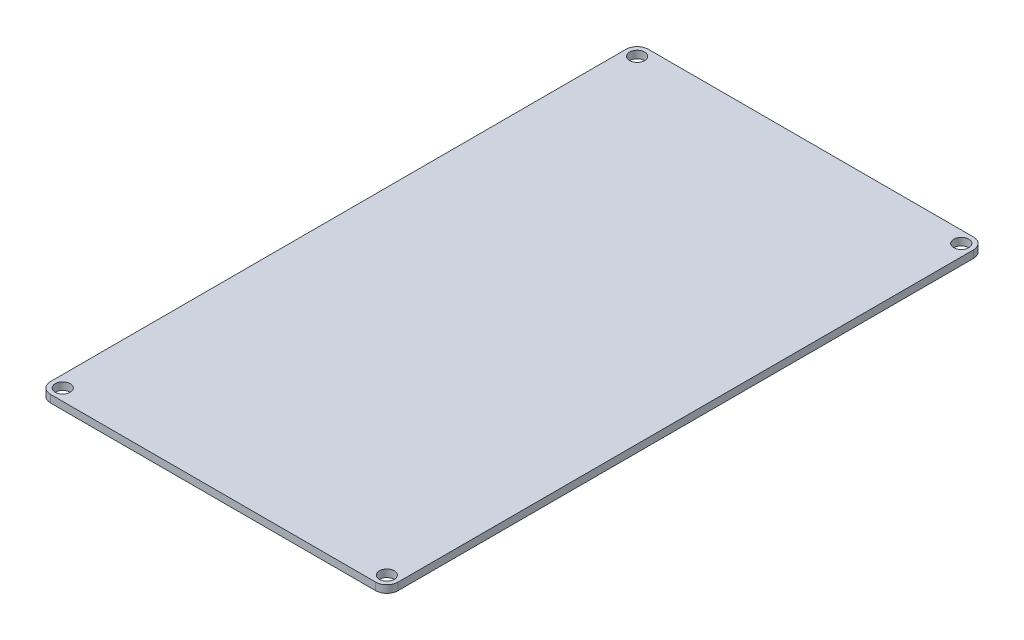
ISO-10303-21;
HEADER;
FILE_DESCRIPTION(('STEP AP214'),'2;1');
FILE_NAME('part.step','',(''),(''),'','','');
FILE_SCHEMA(('AUTOMOTIVE_DESIGN { 1 0 10303 214 1 1 1 1 }'));
ENDSEC;
DATA;
#1=APPLICATION_CONTEXT('core data for automotive mechanical design processes');
#2=APPLICATION_PROTOCOL_DEFINITION('international standard','automotive_design',2000,#1);
#3=PRODUCT_CONTEXT('',#1,'mechanical');
#4=PRODUCT('Part','Part','',(#3));
#5=PRODUCT_RELATED_PRODUCT_CATEGORY('part','',(#4));
#6=PRODUCT_DEFINITION_FORMATION('','',#4);
#7=PRODUCT_DEFINITION_CONTEXT('part definition',#1,'design');
#8=PRODUCT_DEFINITION('design','',#6,#7);
#9=PRODUCT_DEFINITION_SHAPE('','',#8);
#10=(LENGTH_UNIT() NAMED_UNIT(*) SI_UNIT(.MILLI.,.METRE.));
#11=(NAMED_UNIT(*) PLANE_ANGLE_UNIT() SI_UNIT($,.RADIAN.));
#12=(NAMED_UNIT(*) SI_UNIT($,.STERADIAN.) SOLID_ANGLE_UNIT());
#13=UNCERTAINTY_MEASURE_WITH_UNIT(LENGTH_MEASURE(1.E-05),#10,'distance_accuracy_value','');
#14=(GEOMETRIC_REPRESENTATION_CONTEXT(3) GLOBAL_UNCERTAINTY_ASSIGNED_CONTEXT((#13)) GLOBAL_UNIT_ASSIGNED_CONTEXT((#10,
#11,#12)) REPRESENTATION_CONTEXT('',''));
#15=CARTESIAN_POINT('',(0.,0.,0.));
#16=DIRECTION('',(0.,0.,1.));
#17=DIRECTION('',(1.,0.,0.));
#18=AXIS2_PLACEMENT_3D('',#15,#16,#17);
#19=CARTESIAN_POINT('',(0.,2.,-160.));
#20=DIRECTION('',(0.,0.,-1.));
#21=DIRECTION('',(-1.,0.,0.));
#22=AXIS2_PLACEMENT_3D('',#19,#20,#21);
#23=PLANE('',#22);
#24=DIRECTION('',(1.,0.,0.));
#25=VECTOR('',#24,1.);
#26=CARTESIAN_POINT('',(0.,2.,-160.));
#27=LINE('',#26,#25);
#28=CARTESIAN_POINT('',(3.,2.,-160.));
#29=VERTEX_POINT('',#28);
#30=CARTESIAN_POINT('',(90.,2.,-160.));
#31=VERTEX_POINT('',#30);
#32=EDGE_CURVE('E192',#29,#31,#27,.T.);
#33=ORIENTED_EDGE('',*,*,#32,.T.);
#34=DIRECTION('',(0.,-1.,0.));
#35=VECTOR('',#34,1.);
#36=CARTESIAN_POINT('',(90.,0.,-160.));
#37=LINE('',#36,#35);
#38=CARTESIAN_POINT('',(90.,0.,-160.));
#39=VERTEX_POINT('',#38);
#40=EDGE_CURVE('E11',#31,#39,#37,.T.);
#41=ORIENTED_EDGE('',*,*,#40,.T.);
#42=DIRECTION('',(1.,0.,0.));
#43=VECTOR('',#42,1.);
#44=CARTESIAN_POINT('',(0.,0.,-160.));
#45=LINE('',#44,#43);
#46=CARTESIAN_POINT('',(3.,0.,-160.));
#47=VERTEX_POINT('',#46);
#48=EDGE_CURVE('E147',#47,#39,#45,.T.);
#49=ORIENTED_EDGE('',*,*,#48,.F.);
#50=DIRECTION('',(0.,-1.,0.));
#51=VECTOR('',#50,1.);
#52=CARTESIAN_POINT('',(3.,2.,-160.));
#53=LINE('',#52,#51);
#54=EDGE_CURVE('E52',#47,#29,#53,.F.);
#55=ORIENTED_EDGE('',*,*,#54,.T.);
#56=EDGE_LOOP('',(#33,#41,#49,#55));
#57=FACE_BOUND('',#56,.T.);
#58=ADVANCED_FACE('F43',(#57),#23,.T.);
#59=CARTESIAN_POINT('',(0.,2.,0.));
#60=DIRECTION('',(-1.,0.,0.));
#61=DIRECTION('',(0.,0.,1.));
#62=AXIS2_PLACEMENT_3D('',#59,#60,#61);
#63=PLANE('',#62);
#64=DIRECTION('',(0.,0.,-1.));
#65=VECTOR('',#64,1.);
#66=CARTESIAN_POINT('',(0.,0.,0.));
#67=LINE('',#66,#65);
#68=CARTESIAN_POINT('',(0.,0.,-3.));
#69=VERTEX_POINT('',#68);
#70=CARTESIAN_POINT('',(0.,0.,-157.));
#71=VERTEX_POINT('',#70);
#72=EDGE_CURVE('E141',#69,#71,#67,.T.);
#73=ORIENTED_EDGE('',*,*,#72,.F.);
#74=DIRECTION('',(0.,-1.,0.));
#75=VECTOR('',#74,1.);
#76=CARTESIAN_POINT('',(0.,2.,-3.));
#77=LINE('',#76,#75);
#78=CARTESIAN_POINT('',(0.,2.,-3.));
#79=VERTEX_POINT('',#78);
#80=EDGE_CURVE('E116',#69,#79,#77,.F.);
#81=ORIENTED_EDGE('',*,*,#80,.T.);
#82=DIRECTION('',(0.,0.,-1.));
#83=VECTOR('',#82,1.);
#84=CARTESIAN_POINT('',(0.,2.,0.));
#85=LINE('',#84,#83);
#86=CARTESIAN_POINT('',(0.,2.,-157.));
#87=VERTEX_POINT('',#86);
#88=EDGE_CURVE('E203',#79,#87,#85,.T.);
#89=ORIENTED_EDGE('',*,*,#88,.T.);
#90=DIRECTION('',(0.,-1.,0.));
#91=VECTOR('',#90,1.);
#92=CARTESIAN_POINT('',(0.,2.,-157.));
#93=LINE('',#92,#91);
#94=EDGE_CURVE('E122',#87,#71,#93,.T.);
#95=ORIENTED_EDGE('',*,*,#94,.T.);
#96=EDGE_LOOP('',(#73,#81,#89,#95));
#97=FACE_BOUND('',#96,.T.);
#98=ADVANCED_FACE('F208',(#97),#63,.T.);
#99=CARTESIAN_POINT('',(0.,2.,0.));
#100=DIRECTION('',(0.,0.,-1.));
#101=DIRECTION('',(-1.,0.,0.));
#102=AXIS2_PLACEMENT_3D('',#99,#100,#101);
#103=PLANE('',#102);
#104=DIRECTION('',(1.,0.,0.));
#105=VECTOR('',#104,1.);
#106=CARTESIAN_POINT('',(0.,2.,0.));
#107=LINE('',#106,#105);
#108=CARTESIAN_POINT('',(3.,2.,0.));
#109=VERTEX_POINT('',#108);
#110=CARTESIAN_POINT('',(90.,2.,0.));
#111=VERTEX_POINT('',#110);
#112=EDGE_CURVE('E131',#109,#111,#107,.T.);
#113=ORIENTED_EDGE('',*,*,#112,.F.);
#114=DIRECTION('',(0.,-1.,0.));
#115=VECTOR('',#114,1.);
#116=CARTESIAN_POINT('',(3.,0.,0.));
#117=LINE('',#116,#115);
#118=CARTESIAN_POINT('',(3.,0.,0.));
#119=VERTEX_POINT('',#118);
#120=EDGE_CURVE('E115',#109,#119,#117,.T.);
#121=ORIENTED_EDGE('',*,*,#120,.T.);
#122=DIRECTION('',(1.,0.,0.));
#123=VECTOR('',#122,1.);
#124=CARTESIAN_POINT('',(0.,0.,0.));
#125=LINE('',#124,#123);
#126=CARTESIAN_POINT('',(90.,0.,0.));
#127=VERTEX_POINT('',#126);
#128=EDGE_CURVE('E129',#119,#127,#125,.T.);
#129=ORIENTED_EDGE('',*,*,#128,.T.);
#130=DIRECTION('',(0.,-1.,0.));
#131=VECTOR('',#130,1.);
#132=CARTESIAN_POINT('',(90.,2.,0.));
#133=LINE('',#132,#131);
#134=EDGE_CURVE('E134',#127,#111,#133,.F.);
#135=ORIENTED_EDGE('',*,*,#134,.T.);
#136=EDGE_LOOP('',(#113,#121,#129,#135));
#137=FACE_BOUND('',#136,.T.);
#138=ADVANCED_FACE('F128',(#137),#103,.F.);
#139=CARTESIAN_POINT('',(93.,2.,0.));
#140=DIRECTION('',(-1.,0.,0.));
#141=DIRECTION('',(0.,0.,1.));
#142=AXIS2_PLACEMENT_3D('',#139,#140,#141);
#143=PLANE('',#142);
#144=DIRECTION('',(0.,0.,-1.));
#145=VECTOR('',#144,1.);
#146=CARTESIAN_POINT('',(93.,2.,0.));
#147=LINE('',#146,#145);
#148=CARTESIAN_POINT('',(93.,2.,-3.));
#149=VERTEX_POINT('',#148);
#150=CARTESIAN_POINT('',(93.,2.,-157.));
#151=VERTEX_POINT('',#150);
#152=EDGE_CURVE('E226',#149,#151,#147,.T.);
#153=ORIENTED_EDGE('',*,*,#152,.F.);
#154=DIRECTION('',(0.,-1.,0.));
#155=VECTOR('',#154,1.);
#156=CARTESIAN_POINT('',(93.,2.,-3.));
#157=LINE('',#156,#155);
#158=CARTESIAN_POINT('',(93.,0.,-3.));
#159=VERTEX_POINT('',#158);
#160=EDGE_CURVE('E183',#149,#159,#157,.T.);
#161=ORIENTED_EDGE('',*,*,#160,.T.);
#162=DIRECTION('',(0.,0.,-1.));
#163=VECTOR('',#162,1.);
#164=CARTESIAN_POINT('',(93.,0.,0.));
#165=LINE('',#164,#163);
#166=CARTESIAN_POINT('',(93.,0.,-157.));
#167=VERTEX_POINT('',#166);
#168=EDGE_CURVE('E140',#159,#167,#165,.T.);
#169=ORIENTED_EDGE('',*,*,#168,.T.);
#170=DIRECTION('',(0.,-1.,0.));
#171=VECTOR('',#170,1.);
#172=CARTESIAN_POINT('',(93.,2.,-157.));
#173=LINE('',#172,#171);
#174=EDGE_CURVE('E59',#167,#151,#173,.F.);
#175=ORIENTED_EDGE('',*,*,#174,.T.);
#176=EDGE_LOOP('',(#153,#161,#169,#175));
#177=FACE_BOUND('',#176,.T.);
#178=ADVANCED_FACE('F259',(#177),#143,.F.);
#179=CARTESIAN_POINT('',(3.1210255500278,2.,-3.1210255500278));
#180=DIRECTION('',(0.,-1.,0.));
#181=DIRECTION('',(0.,0.,-1.));
#182=AXIS2_PLACEMENT_3D('',#179,#180,#181);
#183=CYLINDRICAL_SURFACE('',#182,2.);
#184=CARTESIAN_POINT('',(3.1210255500278,2.,-3.1210255500278));
#185=DIRECTION('',(0.,1.,0.));
#186=DIRECTION('',(0.,0.,1.));
#187=AXIS2_PLACEMENT_3D('',#184,#185,#186);
#188=CIRCLE('',#187,2.);
#189=CARTESIAN_POINT('',(3.1210255500278,2.,-1.1210255500278));
#190=VERTEX_POINT('',#189);
#191=EDGE_CURVE('E204',#190,#190,#188,.T.);
#192=ORIENTED_EDGE('',*,*,#191,.T.);
#193=EDGE_LOOP('',(#192));
#194=FACE_BOUND('',#193,.T.);
#195=CARTESIAN_POINT('',(3.1210255500278,0.,-3.1210255500278));
#196=DIRECTION('',(0.,1.,0.));
#197=DIRECTION('',(0.,0.,1.));
#198=AXIS2_PLACEMENT_3D('',#195,#196,#197);
#199=CIRCLE('',#198,2.);
#200=CARTESIAN_POINT('',(3.1210255500278,0.,-1.1210255500278));
#201=VERTEX_POINT('',#200);
#202=EDGE_CURVE('E210',#201,#201,#199,.T.);
#203=ORIENTED_EDGE('',*,*,#202,.F.);
#204=EDGE_LOOP('',(#203));
#205=FACE_BOUND('',#204,.T.);
#206=ADVANCED_FACE('F255',(#194,#205),#183,.F.);
#207=CARTESIAN_POINT('',(89.8789744499722,2.,-3.1210255500278));
#208=DIRECTION('',(0.,-1.,0.));
#209=DIRECTION('',(0.,0.,-1.));
#210=AXIS2_PLACEMENT_3D('',#207,#208,#209);
#211=CYLINDRICAL_SURFACE('',#210,2.);
#212=CARTESIAN_POINT('',(89.8789744499722,2.,-3.1210255500278));
#213=DIRECTION('',(0.,1.,0.));
#214=DIRECTION('',(0.,0.,1.));
#215=AXIS2_PLACEMENT_3D('',#212,#213,#214);
#216=CIRCLE('',#215,2.);
#217=CARTESIAN_POINT('',(89.8789744499722,2.,-1.1210255500278));
#218=VERTEX_POINT('',#217);
#219=EDGE_CURVE('E236',#218,#218,#216,.F.);
#220=ORIENTED_EDGE('',*,*,#219,.F.);
#221=EDGE_LOOP('',(#220));
#222=FACE_BOUND('',#221,.T.);
#223=CARTESIAN_POINT('',(89.8789744499722,0.,-3.1210255500278));
#224=DIRECTION('',(0.,1.,0.));
#225=DIRECTION('',(0.,0.,1.));
#226=AXIS2_PLACEMENT_3D('',#223,#224,#225);
#227=CIRCLE('',#226,2.);
#228=CARTESIAN_POINT('',(89.8789744499722,0.,-1.1210255500278));
#229=VERTEX_POINT('',#228);
#230=EDGE_CURVE('E213',#229,#229,#227,.F.);
#231=ORIENTED_EDGE('',*,*,#230,.T.);
#232=EDGE_LOOP('',(#231));
#233=FACE_BOUND('',#232,.T.);
#234=ADVANCED_FACE('F258',(#222,#233),#211,.F.);
#235=CARTESIAN_POINT('',(89.8789744499721,2.,-156.878974449972));
#236=DIRECTION('',(0.,-1.,0.));
#237=DIRECTION('',(0.,0.,-1.));
#238=AXIS2_PLACEMENT_3D('',#235,#236,#237);
#239=CYLINDRICAL_SURFACE('',#238,2.);
#240=CARTESIAN_POINT('',(89.8789744499721,2.,-156.878974449972));
#241=DIRECTION('',(0.,1.,0.));
#242=DIRECTION('',(0.,0.,1.));
#243=AXIS2_PLACEMENT_3D('',#240,#241,#242);
#244=CIRCLE('',#243,2.);
#245=CARTESIAN_POINT('',(89.8789744499721,2.,-154.878974449972));
#246=VERTEX_POINT('',#245);
#247=EDGE_CURVE('E154',#246,#246,#244,.T.);
#248=ORIENTED_EDGE('',*,*,#247,.T.);
#249=EDGE_LOOP('',(#248));
#250=FACE_BOUND('',#249,.T.);
#251=CARTESIAN_POINT('',(89.8789744499721,0.,-156.878974449972));
#252=DIRECTION('',(0.,1.,0.));
#253=DIRECTION('',(0.,0.,1.));
#254=AXIS2_PLACEMENT_3D('',#251,#252,#253);
#255=CIRCLE('',#254,2.);
#256=CARTESIAN_POINT('',(89.8789744499721,0.,-154.878974449972));
#257=VERTEX_POINT('',#256);
#258=EDGE_CURVE('E219',#257,#257,#255,.T.);
#259=ORIENTED_EDGE('',*,*,#258,.F.);
#260=EDGE_LOOP('',(#259));
#261=FACE_BOUND('',#260,.T.);
#262=ADVANCED_FACE('F244',(#250,#261),#239,.F.);
#263=CARTESIAN_POINT('',(3.12102555002776,2.,-156.878974449972));
#264=DIRECTION('',(0.,-1.,0.));
#265=DIRECTION('',(0.,0.,-1.));
#266=AXIS2_PLACEMENT_3D('',#263,#264,#265);
#267=CYLINDRICAL_SURFACE('',#266,2.);
#268=CARTESIAN_POINT('',(3.12102555002776,2.,-156.878974449972));
#269=DIRECTION('',(0.,1.,0.));
#270=DIRECTION('',(0.,0.,1.));
#271=AXIS2_PLACEMENT_3D('',#268,#269,#270);
#272=CIRCLE('',#271,2.);
#273=CARTESIAN_POINT('',(3.12102555002776,2.,-154.878974449972));
#274=VERTEX_POINT('',#273);
#275=EDGE_CURVE('E156',#274,#274,#272,.F.);
#276=ORIENTED_EDGE('',*,*,#275,.F.);
#277=EDGE_LOOP('',(#276));
#278=FACE_BOUND('',#277,.T.);
#279=CARTESIAN_POINT('',(3.12102555002776,0.,-156.878974449972));
#280=DIRECTION('',(0.,1.,0.));
#281=DIRECTION('',(0.,0.,1.));
#282=AXIS2_PLACEMENT_3D('',#279,#280,#281);
#283=CIRCLE('',#282,2.);
#284=CARTESIAN_POINT('',(3.12102555002776,0.,-154.878974449972));
#285=VERTEX_POINT('',#284);
#286=EDGE_CURVE('E145',#285,#285,#283,.F.);
#287=ORIENTED_EDGE('',*,*,#286,.T.);
#288=EDGE_LOOP('',(#287));
#289=FACE_BOUND('',#288,.T.);
#290=ADVANCED_FACE('F249',(#278,#289),#267,.F.);
#291=CARTESIAN_POINT('',(0.,2.,0.));
#292=DIRECTION('',(0.,1.,0.));
#293=DIRECTION('',(0.,0.,1.));
#294=AXIS2_PLACEMENT_3D('',#291,#292,#293);
#295=PLANE('',#294);
#296=ORIENTED_EDGE('',*,*,#247,.F.);
#297=EDGE_LOOP('',(#296));
#298=FACE_BOUND('',#297,.T.);
#299=ORIENTED_EDGE('',*,*,#219,.T.);
#300=EDGE_LOOP('',(#299));
#301=FACE_BOUND('',#300,.T.);
#302=ORIENTED_EDGE('',*,*,#191,.F.);
#303=EDGE_LOOP('',(#302));
#304=FACE_BOUND('',#303,.T.);
#305=ORIENTED_EDGE('',*,*,#88,.F.);
#306=CARTESIAN_POINT('',(3.,2.,-3.));
#307=DIRECTION('',(0.,1.,0.));
#308=DIRECTION('',(0.,0.,1.));
#309=AXIS2_PLACEMENT_3D('',#306,#307,#308);
#310=CIRCLE('',#309,3.);
#311=EDGE_CURVE('E178',#79,#109,#310,.T.);
#312=ORIENTED_EDGE('',*,*,#311,.T.);
#313=ORIENTED_EDGE('',*,*,#112,.T.);
#314=CARTESIAN_POINT('',(90.,2.,-3.));
#315=DIRECTION('',(0.,1.,0.));
#316=DIRECTION('',(0.,0.,1.));
#317=AXIS2_PLACEMENT_3D('',#314,#315,#316);
#318=CIRCLE('',#317,3.);
#319=EDGE_CURVE('E66',#111,#149,#318,.T.);
#320=ORIENTED_EDGE('',*,*,#319,.T.);
#321=ORIENTED_EDGE('',*,*,#152,.T.);
#322=CARTESIAN_POINT('',(90.,2.,-157.));
#323=DIRECTION('',(0.,1.,0.));
#324=DIRECTION('',(0.,0.,1.));
#325=AXIS2_PLACEMENT_3D('',#322,#323,#324);
#326=CIRCLE('',#325,3.);
#327=EDGE_CURVE('E173',#151,#31,#326,.T.);
#328=ORIENTED_EDGE('',*,*,#327,.T.);
#329=ORIENTED_EDGE('',*,*,#32,.F.);
#330=CARTESIAN_POINT('',(3.,2.,-157.));
#331=DIRECTION('',(0.,1.,0.));
#332=DIRECTION('',(0.,0.,1.));
#333=AXIS2_PLACEMENT_3D('',#330,#331,#332);
#334=CIRCLE('',#333,3.);
#335=EDGE_CURVE('E170',#29,#87,#334,.T.);
#336=ORIENTED_EDGE('',*,*,#335,.T.);
#337=EDGE_LOOP('',(#305,#312,#313,#320,#321,#328,#329,#336));
#338=FACE_BOUND('',#337,.T.);
#339=ORIENTED_EDGE('',*,*,#275,.T.);
#340=EDGE_LOOP('',(#339));
#341=FACE_BOUND('',#340,.T.);
#342=ADVANCED_FACE('F198',(#298,#301,#304,#338,#341),#295,.T.);
#343=CARTESIAN_POINT('',(0.,0.,0.));
#344=DIRECTION('',(0.,1.,0.));
#345=DIRECTION('',(0.,0.,1.));
#346=AXIS2_PLACEMENT_3D('',#343,#344,#345);
#347=PLANE('',#346);
#348=ORIENTED_EDGE('',*,*,#258,.T.);
#349=EDGE_LOOP('',(#348));
#350=FACE_BOUND('',#349,.T.);
#351=ORIENTED_EDGE('',*,*,#230,.F.);
#352=EDGE_LOOP('',(#351));
#353=FACE_BOUND('',#352,.T.);
#354=ORIENTED_EDGE('',*,*,#202,.T.);
#355=EDGE_LOOP('',(#354));
#356=FACE_BOUND('',#355,.T.);
#357=ORIENTED_EDGE('',*,*,#128,.F.);
#358=CARTESIAN_POINT('',(3.,0.,-3.));
#359=DIRECTION('',(0.,1.,0.));
#360=DIRECTION('',(0.,0.,1.));
#361=AXIS2_PLACEMENT_3D('',#358,#359,#360);
#362=CIRCLE('',#361,3.);
#363=EDGE_CURVE('E111',#119,#69,#362,.F.);
#364=ORIENTED_EDGE('',*,*,#363,.T.);
#365=ORIENTED_EDGE('',*,*,#72,.T.);
#366=CARTESIAN_POINT('',(3.,0.,-157.));
#367=DIRECTION('',(0.,1.,0.));
#368=DIRECTION('',(0.,0.,1.));
#369=AXIS2_PLACEMENT_3D('',#366,#367,#368);
#370=CIRCLE('',#369,3.);
#371=EDGE_CURVE('E133',#71,#47,#370,.F.);
#372=ORIENTED_EDGE('',*,*,#371,.T.);
#373=ORIENTED_EDGE('',*,*,#48,.T.);
#374=CARTESIAN_POINT('',(90.,0.,-157.));
#375=DIRECTION('',(0.,1.,0.));
#376=DIRECTION('',(0.,0.,1.));
#377=AXIS2_PLACEMENT_3D('',#374,#375,#376);
#378=CIRCLE('',#377,3.);
#379=EDGE_CURVE('E160',#39,#167,#378,.F.);
#380=ORIENTED_EDGE('',*,*,#379,.T.);
#381=ORIENTED_EDGE('',*,*,#168,.F.);
#382=CARTESIAN_POINT('',(90.,0.,-3.));
#383=DIRECTION('',(0.,1.,0.));
#384=DIRECTION('',(0.,0.,1.));
#385=AXIS2_PLACEMENT_3D('',#382,#383,#384);
#386=CIRCLE('',#385,3.);
#387=EDGE_CURVE('E123',#159,#127,#386,.F.);
#388=ORIENTED_EDGE('',*,*,#387,.T.);
#389=EDGE_LOOP('',(#357,#364,#365,#372,#373,#380,#381,#388));
#390=FACE_BOUND('',#389,.T.);
#391=ORIENTED_EDGE('',*,*,#286,.F.);
#392=EDGE_LOOP('',(#391));
#393=FACE_BOUND('',#392,.T.);
#394=ADVANCED_FACE('F136',(#350,#353,#356,#390,#393),#347,.F.);
#395=CARTESIAN_POINT('',(3.,2.,-3.));
#396=DIRECTION('',(0.,1.,0.));
#397=DIRECTION('',(0.,0.,1.));
#398=AXIS2_PLACEMENT_3D('',#395,#396,#397);
#399=CYLINDRICAL_SURFACE('',#398,3.);
#400=ORIENTED_EDGE('',*,*,#311,.F.);
#401=ORIENTED_EDGE('',*,*,#80,.F.);
#402=ORIENTED_EDGE('',*,*,#363,.F.);
#403=ORIENTED_EDGE('',*,*,#120,.F.);
#404=EDGE_LOOP('',(#400,#401,#402,#403));
#405=FACE_BOUND('',#404,.T.);
#406=ADVANCED_FACE('F114',(#405),#399,.T.);
#407=CARTESIAN_POINT('',(90.,2.,-3.));
#408=DIRECTION('',(0.,-1.,0.));
#409=DIRECTION('',(0.,0.,-1.));
#410=AXIS2_PLACEMENT_3D('',#407,#408,#409);
#411=CYLINDRICAL_SURFACE('',#410,3.);
#412=ORIENTED_EDGE('',*,*,#319,.F.);
#413=ORIENTED_EDGE('',*,*,#134,.F.);
#414=ORIENTED_EDGE('',*,*,#387,.F.);
#415=ORIENTED_EDGE('',*,*,#160,.F.);
#416=EDGE_LOOP('',(#412,#413,#414,#415));
#417=FACE_BOUND('',#416,.T.);
#418=ADVANCED_FACE('F269',(#417),#411,.T.);
#419=CARTESIAN_POINT('',(90.,2.,-157.));
#420=DIRECTION('',(0.,1.,0.));
#421=DIRECTION('',(0.,0.,1.));
#422=AXIS2_PLACEMENT_3D('',#419,#420,#421);
#423=CYLINDRICAL_SURFACE('',#422,3.);
#424=ORIENTED_EDGE('',*,*,#327,.F.);
#425=ORIENTED_EDGE('',*,*,#174,.F.);
#426=ORIENTED_EDGE('',*,*,#379,.F.);
#427=ORIENTED_EDGE('',*,*,#40,.F.);
#428=EDGE_LOOP('',(#424,#425,#426,#427));
#429=FACE_BOUND('',#428,.T.);
#430=ADVANCED_FACE('F287',(#429),#423,.T.);
#431=CARTESIAN_POINT('',(3.,2.,-157.));
#432=DIRECTION('',(0.,-1.,0.));
#433=DIRECTION('',(0.,0.,-1.));
#434=AXIS2_PLACEMENT_3D('',#431,#432,#433);
#435=CYLINDRICAL_SURFACE('',#434,3.);
#436=ORIENTED_EDGE('',*,*,#335,.F.);
#437=ORIENTED_EDGE('',*,*,#54,.F.);
#438=ORIENTED_EDGE('',*,*,#371,.F.);
#439=ORIENTED_EDGE('',*,*,#94,.F.);
#440=EDGE_LOOP('',(#436,#437,#438,#439));
#441=FACE_BOUND('',#440,.T.);
#442=ADVANCED_FACE('F45',(#441),#435,.T.);
#443=CLOSED_SHELL('',(#58,#98,#138,#178,#206,#234,#262,#290,#342,#394,#406,#418,#430,#442));
#444=MANIFOLD_SOLID_BREP('B2',#443);
#445=ADVANCED_BREP_SHAPE_REPRESENTATION('',(#18,#444),#14);
#446=SHAPE_DEFINITION_REPRESENTATION(#9,#445);
ENDSEC;
END-ISO-10303-21;
